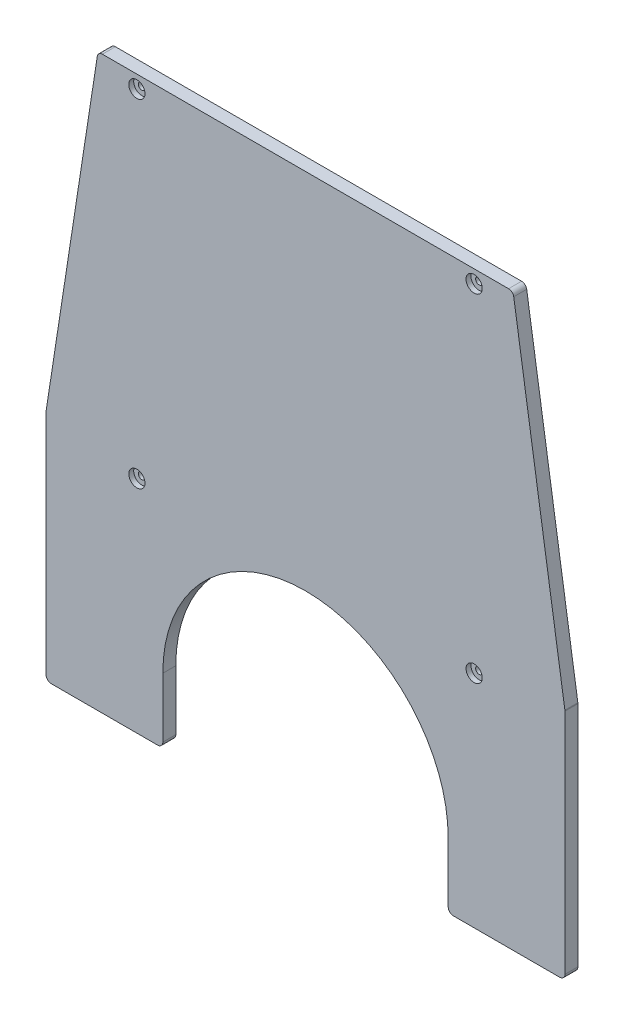
ISO-10303-21;
HEADER;
FILE_DESCRIPTION(('STEP AP214'),'2;1');
FILE_NAME('part.step','',(''),(''),'','','');
FILE_SCHEMA(('AUTOMOTIVE_DESIGN { 1 0 10303 214 1 1 1 1 }'));
ENDSEC;
DATA;
#1=APPLICATION_CONTEXT('core data for automotive mechanical design processes');
#2=APPLICATION_PROTOCOL_DEFINITION('international standard','automotive_design',2000,#1);
#3=PRODUCT_CONTEXT('',#1,'mechanical');
#4=PRODUCT('Part','Part','',(#3));
#5=PRODUCT_RELATED_PRODUCT_CATEGORY('part','',(#4));
#6=PRODUCT_DEFINITION_FORMATION('','',#4);
#7=PRODUCT_DEFINITION_CONTEXT('part definition',#1,'design');
#8=PRODUCT_DEFINITION('design','',#6,#7);
#9=PRODUCT_DEFINITION_SHAPE('','',#8);
#10=(LENGTH_UNIT() NAMED_UNIT(*) SI_UNIT(.MILLI.,.METRE.));
#11=(NAMED_UNIT(*) PLANE_ANGLE_UNIT() SI_UNIT($,.RADIAN.));
#12=(NAMED_UNIT(*) SI_UNIT($,.STERADIAN.) SOLID_ANGLE_UNIT());
#13=UNCERTAINTY_MEASURE_WITH_UNIT(LENGTH_MEASURE(1.E-05),#10,'distance_accuracy_value','');
#14=(GEOMETRIC_REPRESENTATION_CONTEXT(3) GLOBAL_UNCERTAINTY_ASSIGNED_CONTEXT((#13)) GLOBAL_UNIT_ASSIGNED_CONTEXT((#10,
#11,#12)) REPRESENTATION_CONTEXT('',''));
#15=CARTESIAN_POINT('',(0.,0.,0.));
#16=DIRECTION('',(0.,0.,1.));
#17=DIRECTION('',(1.,0.,0.));
#18=AXIS2_PLACEMENT_3D('',#15,#16,#17);
#19=CARTESIAN_POINT('',(0.,0.,12.7));
#20=DIRECTION('',(0.,0.,-1.));
#21=DIRECTION('',(-1.,0.,0.));
#22=AXIS2_PLACEMENT_3D('',#19,#20,#21);
#23=CYLINDRICAL_SURFACE('',#22,139.7);
#24=CARTESIAN_POINT('',(0.,0.,0.));
#25=DIRECTION('',(0.,0.,1.));
#26=DIRECTION('',(1.,0.,0.));
#27=AXIS2_PLACEMENT_3D('',#24,#25,#26);
#28=CIRCLE('',#27,139.7);
#29=CARTESIAN_POINT('',(139.7,0.,0.));
#30=VERTEX_POINT('',#29);
#31=CARTESIAN_POINT('',(-139.7,0.,0.));
#32=VERTEX_POINT('',#31);
#33=EDGE_CURVE('E179',#30,#32,#28,.T.);
#34=ORIENTED_EDGE('',*,*,#33,.F.);
#35=DIRECTION('',(0.,0.,-1.));
#36=VECTOR('',#35,1.);
#37=CARTESIAN_POINT('',(139.7,0.,12.7));
#38=LINE('',#37,#36);
#39=CARTESIAN_POINT('',(139.7,0.,12.7));
#40=VERTEX_POINT('',#39);
#41=EDGE_CURVE('E174',#40,#30,#38,.T.);
#42=ORIENTED_EDGE('',*,*,#41,.F.);
#43=CARTESIAN_POINT('',(0.,0.,12.7));
#44=DIRECTION('',(0.,0.,1.));
#45=DIRECTION('',(1.,0.,0.));
#46=AXIS2_PLACEMENT_3D('',#43,#44,#45);
#47=CIRCLE('',#46,139.7);
#48=CARTESIAN_POINT('',(-139.7,0.,12.7));
#49=VERTEX_POINT('',#48);
#50=EDGE_CURVE('E177',#40,#49,#47,.T.);
#51=ORIENTED_EDGE('',*,*,#50,.T.);
#52=DIRECTION('',(0.,0.,-1.));
#53=VECTOR('',#52,1.);
#54=CARTESIAN_POINT('',(-139.7,0.,12.7));
#55=LINE('',#54,#53);
#56=EDGE_CURVE('E185',#49,#32,#55,.T.);
#57=ORIENTED_EDGE('',*,*,#56,.T.);
#58=EDGE_LOOP('',(#34,#42,#51,#57));
#59=FACE_BOUND('',#58,.T.);
#60=ADVANCED_FACE('F47',(#59),#23,.F.);
#61=CARTESIAN_POINT('',(139.7,0.,12.7));
#62=DIRECTION('',(1.,0.,0.));
#63=DIRECTION('',(0.,0.,-1.));
#64=AXIS2_PLACEMENT_3D('',#61,#62,#63);
#65=PLANE('',#64);
#66=DIRECTION('',(0.,-1.,0.));
#67=VECTOR('',#66,1.);
#68=CARTESIAN_POINT('',(139.7,0.,0.));
#69=LINE('',#68,#67);
#70=CARTESIAN_POINT('',(139.7,-58.42,0.));
#71=VERTEX_POINT('',#70);
#72=EDGE_CURVE('E240',#30,#71,#69,.T.);
#73=ORIENTED_EDGE('',*,*,#72,.T.);
#74=DIRECTION('',(0.,0.,-1.));
#75=VECTOR('',#74,1.);
#76=CARTESIAN_POINT('',(139.7,-58.42,12.7));
#77=LINE('',#76,#75);
#78=CARTESIAN_POINT('',(139.7,-58.42,12.7));
#79=VERTEX_POINT('',#78);
#80=EDGE_CURVE('E191',#71,#79,#77,.F.);
#81=ORIENTED_EDGE('',*,*,#80,.T.);
#82=DIRECTION('',(0.,-1.,0.));
#83=VECTOR('',#82,1.);
#84=CARTESIAN_POINT('',(139.7,0.,12.7));
#85=LINE('',#84,#83);
#86=EDGE_CURVE('E188',#40,#79,#85,.T.);
#87=ORIENTED_EDGE('',*,*,#86,.F.);
#88=ORIENTED_EDGE('',*,*,#41,.T.);
#89=EDGE_LOOP('',(#73,#81,#87,#88));
#90=FACE_BOUND('',#89,.T.);
#91=ADVANCED_FACE('F189',(#90),#65,.F.);
#92=CARTESIAN_POINT('',(0.,-63.5,12.7));
#93=DIRECTION('',(0.,1.,0.));
#94=DIRECTION('',(0.,0.,1.));
#95=AXIS2_PLACEMENT_3D('',#92,#93,#94);
#96=PLANE('',#95);
#97=DIRECTION('',(1.,0.,0.));
#98=VECTOR('',#97,1.);
#99=CARTESIAN_POINT('',(0.,-63.5,0.));
#100=LINE('',#99,#98);
#101=CARTESIAN_POINT('',(144.78,-63.5,0.));
#102=VERTEX_POINT('',#101);
#103=CARTESIAN_POINT('',(248.92,-63.5,0.));
#104=VERTEX_POINT('',#103);
#105=EDGE_CURVE('E243',#102,#104,#100,.T.);
#106=ORIENTED_EDGE('',*,*,#105,.T.);
#107=DIRECTION('',(0.,0.,-1.));
#108=VECTOR('',#107,1.);
#109=CARTESIAN_POINT('',(248.92,-63.5,12.7));
#110=LINE('',#109,#108);
#111=CARTESIAN_POINT('',(248.92,-63.5,12.7));
#112=VERTEX_POINT('',#111);
#113=EDGE_CURVE('E356',#104,#112,#110,.F.);
#114=ORIENTED_EDGE('',*,*,#113,.T.);
#115=DIRECTION('',(1.,0.,0.));
#116=VECTOR('',#115,1.);
#117=CARTESIAN_POINT('',(0.,-63.5,12.7));
#118=LINE('',#117,#116);
#119=CARTESIAN_POINT('',(144.78,-63.5,12.7));
#120=VERTEX_POINT('',#119);
#121=EDGE_CURVE('E194',#120,#112,#118,.T.);
#122=ORIENTED_EDGE('',*,*,#121,.F.);
#123=DIRECTION('',(0.,0.,-1.));
#124=VECTOR('',#123,1.);
#125=CARTESIAN_POINT('',(144.78,-63.5,12.7));
#126=LINE('',#125,#124);
#127=EDGE_CURVE('E352',#120,#102,#126,.T.);
#128=ORIENTED_EDGE('',*,*,#127,.T.);
#129=EDGE_LOOP('',(#106,#114,#122,#128));
#130=FACE_BOUND('',#129,.T.);
#131=ADVANCED_FACE('F388',(#130),#96,.F.);
#132=CARTESIAN_POINT('',(254.,0.,12.7));
#133=DIRECTION('',(-1.,0.,0.));
#134=DIRECTION('',(0.,0.,1.));
#135=AXIS2_PLACEMENT_3D('',#132,#133,#134);
#136=PLANE('',#135);
#137=DIRECTION('',(0.,1.,0.));
#138=VECTOR('',#137,1.);
#139=CARTESIAN_POINT('',(254.,0.,0.));
#140=LINE('',#139,#138);
#141=CARTESIAN_POINT('',(254.,-58.42,0.));
#142=VERTEX_POINT('',#141);
#143=CARTESIAN_POINT('',(254.,164.711516047567,0.));
#144=VERTEX_POINT('',#143);
#145=EDGE_CURVE('E247',#142,#144,#140,.T.);
#146=ORIENTED_EDGE('',*,*,#145,.T.);
#147=DIRECTION('',(0.,0.,-1.));
#148=VECTOR('',#147,1.);
#149=CARTESIAN_POINT('',(254.,164.711516047567,12.7));
#150=LINE('',#149,#148);
#151=CARTESIAN_POINT('',(254.,164.711516047567,12.7));
#152=VERTEX_POINT('',#151);
#153=EDGE_CURVE('E349',#144,#152,#150,.F.);
#154=ORIENTED_EDGE('',*,*,#153,.T.);
#155=DIRECTION('',(0.,1.,0.));
#156=VECTOR('',#155,1.);
#157=CARTESIAN_POINT('',(254.,0.,12.7));
#158=LINE('',#157,#156);
#159=CARTESIAN_POINT('',(254.,-58.42,12.7));
#160=VERTEX_POINT('',#159);
#161=EDGE_CURVE('E213',#160,#152,#158,.T.);
#162=ORIENTED_EDGE('',*,*,#161,.F.);
#163=DIRECTION('',(0.,0.,-1.));
#164=VECTOR('',#163,1.);
#165=CARTESIAN_POINT('',(254.,-58.42,12.7));
#166=LINE('',#165,#164);
#167=EDGE_CURVE('E345',#160,#142,#166,.T.);
#168=ORIENTED_EDGE('',*,*,#167,.T.);
#169=EDGE_LOOP('',(#146,#154,#162,#168));
#170=FACE_BOUND('',#169,.T.);
#171=ADVANCED_FACE('F396',(#170),#136,.F.);
#172=CARTESIAN_POINT('',(272.939884393064,41.9907514450867,12.7));
#173=DIRECTION('',(-0.988371697650617,-0.152057184253941,0.));
#174=DIRECTION('',(0.152057184253941,-0.988371697650617,0.));
#175=AXIS2_PLACEMENT_3D('',#172,#173,#174);
#176=PLANE('',#175);
#177=DIRECTION('',(-0.152057184253941,0.988371697650617,0.));
#178=VECTOR('',#177,1.);
#179=CARTESIAN_POINT('',(272.939884393064,41.9907514450867,0.));
#180=LINE('',#179,#178);
#181=CARTESIAN_POINT('',(253.940928224065,165.483966543577,0.));
#182=VERTEX_POINT('',#181);
#183=CARTESIAN_POINT('',(203.862699923691,490.99245049601,0.));
#184=VERTEX_POINT('',#183);
#185=EDGE_CURVE('E251',#182,#184,#180,.T.);
#186=ORIENTED_EDGE('',*,*,#185,.T.);
#187=DIRECTION('',(0.,0.,-1.));
#188=VECTOR('',#187,1.);
#189=CARTESIAN_POINT('',(203.862699923691,490.99245049601,12.7));
#190=LINE('',#189,#188);
#191=CARTESIAN_POINT('',(203.862699923691,490.99245049601,12.7));
#192=VERTEX_POINT('',#191);
#193=EDGE_CURVE('E342',#184,#192,#190,.F.);
#194=ORIENTED_EDGE('',*,*,#193,.T.);
#195=DIRECTION('',(-0.152057184253941,0.988371697650617,0.));
#196=VECTOR('',#195,1.);
#197=CARTESIAN_POINT('',(272.939884393064,41.9907514450867,12.7));
#198=LINE('',#197,#196);
#199=CARTESIAN_POINT('',(253.940928224065,165.483966543577,12.7));
#200=VERTEX_POINT('',#199);
#201=EDGE_CURVE('E217',#200,#192,#198,.T.);
#202=ORIENTED_EDGE('',*,*,#201,.F.);
#203=DIRECTION('',(0.,0.,-1.));
#204=VECTOR('',#203,1.);
#205=CARTESIAN_POINT('',(253.940928224065,165.483966543577,12.7));
#206=LINE('',#205,#204);
#207=EDGE_CURVE('E338',#200,#182,#206,.T.);
#208=ORIENTED_EDGE('',*,*,#207,.T.);
#209=EDGE_LOOP('',(#186,#194,#202,#208));
#210=FACE_BOUND('',#209,.T.);
#211=ADVANCED_FACE('F405',(#210),#176,.F.);
#212=CARTESIAN_POINT('',(0.,495.3,12.7));
#213=DIRECTION('',(0.,-1.,0.));
#214=DIRECTION('',(1.,0.,0.));
#215=AXIS2_PLACEMENT_3D('',#212,#213,#214);
#216=PLANE('',#215);
#217=DIRECTION('',(-1.,0.,0.));
#218=VECTOR('',#217,1.);
#219=CARTESIAN_POINT('',(0.,495.3,0.));
#220=LINE('',#219,#218);
#221=CARTESIAN_POINT('',(198.841771699626,495.3,0.));
#222=VERTEX_POINT('',#221);
#223=CARTESIAN_POINT('',(-198.841771699626,495.3,0.));
#224=VERTEX_POINT('',#223);
#225=EDGE_CURVE('E255',#222,#224,#220,.T.);
#226=ORIENTED_EDGE('',*,*,#225,.T.);
#227=DIRECTION('',(0.,0.,-1.));
#228=VECTOR('',#227,1.);
#229=CARTESIAN_POINT('',(-198.841771699626,495.3,12.7));
#230=LINE('',#229,#228);
#231=CARTESIAN_POINT('',(-198.841771699626,495.3,12.7));
#232=VERTEX_POINT('',#231);
#233=EDGE_CURVE('E335',#224,#232,#230,.F.);
#234=ORIENTED_EDGE('',*,*,#233,.T.);
#235=DIRECTION('',(-1.,0.,0.));
#236=VECTOR('',#235,1.);
#237=CARTESIAN_POINT('',(0.,495.3,12.7));
#238=LINE('',#237,#236);
#239=CARTESIAN_POINT('',(198.841771699626,495.3,12.7));
#240=VERTEX_POINT('',#239);
#241=EDGE_CURVE('E221',#240,#232,#238,.T.);
#242=ORIENTED_EDGE('',*,*,#241,.F.);
#243=DIRECTION('',(0.,0.,-1.));
#244=VECTOR('',#243,1.);
#245=CARTESIAN_POINT('',(198.841771699626,495.3,12.7));
#246=LINE('',#245,#244);
#247=EDGE_CURVE('E331',#240,#222,#246,.T.);
#248=ORIENTED_EDGE('',*,*,#247,.T.);
#249=EDGE_LOOP('',(#226,#234,#242,#248));
#250=FACE_BOUND('',#249,.T.);
#251=ADVANCED_FACE('F414',(#250),#216,.F.);
#252=CARTESIAN_POINT('',(-272.939884393064,41.9907514450867,12.7));
#253=DIRECTION('',(-0.988371697650617,0.152057184253941,0.));
#254=DIRECTION('',(-0.152057184253941,-0.988371697650617,0.));
#255=AXIS2_PLACEMENT_3D('',#252,#253,#254);
#256=PLANE('',#255);
#257=DIRECTION('',(0.152057184253941,0.988371697650617,0.));
#258=VECTOR('',#257,1.);
#259=CARTESIAN_POINT('',(-272.939884393064,41.9907514450867,0.));
#260=LINE('',#259,#258);
#261=CARTESIAN_POINT('',(-253.940928224065,165.483966543577,0.));
#262=VERTEX_POINT('',#261);
#263=CARTESIAN_POINT('',(-203.862699923691,490.99245049601,0.));
#264=VERTEX_POINT('',#263);
#265=EDGE_CURVE('E259',#262,#264,#260,.T.);
#266=ORIENTED_EDGE('',*,*,#265,.F.);
#267=DIRECTION('',(0.,0.,-1.));
#268=VECTOR('',#267,1.);
#269=CARTESIAN_POINT('',(-253.940928224065,165.483966543577,12.7));
#270=LINE('',#269,#268);
#271=CARTESIAN_POINT('',(-253.940928224065,165.483966543577,12.7));
#272=VERTEX_POINT('',#271);
#273=EDGE_CURVE('E306',#262,#272,#270,.F.);
#274=ORIENTED_EDGE('',*,*,#273,.T.);
#275=DIRECTION('',(0.152057184253941,0.988371697650617,0.));
#276=VECTOR('',#275,1.);
#277=CARTESIAN_POINT('',(-272.939884393064,41.9907514450867,12.7));
#278=LINE('',#277,#276);
#279=CARTESIAN_POINT('',(-203.862699923691,490.99245049601,12.7));
#280=VERTEX_POINT('',#279);
#281=EDGE_CURVE('E225',#272,#280,#278,.T.);
#282=ORIENTED_EDGE('',*,*,#281,.T.);
#283=DIRECTION('',(0.,0.,-1.));
#284=VECTOR('',#283,1.);
#285=CARTESIAN_POINT('',(-203.862699923691,490.99245049601,0.));
#286=LINE('',#285,#284);
#287=EDGE_CURVE('E302',#280,#264,#286,.T.);
#288=ORIENTED_EDGE('',*,*,#287,.T.);
#289=EDGE_LOOP('',(#266,#274,#282,#288));
#290=FACE_BOUND('',#289,.T.);
#291=ADVANCED_FACE('F423',(#290),#256,.T.);
#292=CARTESIAN_POINT('',(-254.,0.,12.7));
#293=DIRECTION('',(-1.,0.,0.));
#294=DIRECTION('',(0.,0.,1.));
#295=AXIS2_PLACEMENT_3D('',#292,#293,#294);
#296=PLANE('',#295);
#297=DIRECTION('',(0.,1.,0.));
#298=VECTOR('',#297,1.);
#299=CARTESIAN_POINT('',(-254.,0.,12.7));
#300=LINE('',#299,#298);
#301=CARTESIAN_POINT('',(-254.,-58.42,12.7));
#302=VERTEX_POINT('',#301);
#303=CARTESIAN_POINT('',(-254.,164.711516047567,12.7));
#304=VERTEX_POINT('',#303);
#305=EDGE_CURVE('E229',#302,#304,#300,.T.);
#306=ORIENTED_EDGE('',*,*,#305,.T.);
#307=DIRECTION('',(0.,0.,-1.));
#308=VECTOR('',#307,1.);
#309=CARTESIAN_POINT('',(-254.,164.711516047567,12.7));
#310=LINE('',#309,#308);
#311=CARTESIAN_POINT('',(-254.,164.711516047567,0.));
#312=VERTEX_POINT('',#311);
#313=EDGE_CURVE('E274',#304,#312,#310,.T.);
#314=ORIENTED_EDGE('',*,*,#313,.T.);
#315=DIRECTION('',(0.,1.,0.));
#316=VECTOR('',#315,1.);
#317=CARTESIAN_POINT('',(-254.,0.,0.));
#318=LINE('',#317,#316);
#319=CARTESIAN_POINT('',(-254.,-58.42,0.));
#320=VERTEX_POINT('',#319);
#321=EDGE_CURVE('E263',#320,#312,#318,.T.);
#322=ORIENTED_EDGE('',*,*,#321,.F.);
#323=DIRECTION('',(0.,0.,-1.));
#324=VECTOR('',#323,1.);
#325=CARTESIAN_POINT('',(-254.,-58.42,12.7));
#326=LINE('',#325,#324);
#327=EDGE_CURVE('E184',#320,#302,#326,.F.);
#328=ORIENTED_EDGE('',*,*,#327,.T.);
#329=EDGE_LOOP('',(#306,#314,#322,#328));
#330=FACE_BOUND('',#329,.T.);
#331=ADVANCED_FACE('F429',(#330),#296,.T.);
#332=CARTESIAN_POINT('',(0.,-63.5,12.7));
#333=DIRECTION('',(0.,-1.,0.));
#334=DIRECTION('',(0.,0.,-1.));
#335=AXIS2_PLACEMENT_3D('',#332,#333,#334);
#336=PLANE('',#335);
#337=DIRECTION('',(-1.,0.,0.));
#338=VECTOR('',#337,1.);
#339=CARTESIAN_POINT('',(0.,-63.5,0.));
#340=LINE('',#339,#338);
#341=CARTESIAN_POINT('',(-144.78,-63.5,0.));
#342=VERTEX_POINT('',#341);
#343=CARTESIAN_POINT('',(-248.92,-63.5,0.));
#344=VERTEX_POINT('',#343);
#345=EDGE_CURVE('E204',#342,#344,#340,.T.);
#346=ORIENTED_EDGE('',*,*,#345,.F.);
#347=DIRECTION('',(0.,0.,-1.));
#348=VECTOR('',#347,1.);
#349=CARTESIAN_POINT('',(-144.78,-63.5,12.7));
#350=LINE('',#349,#348);
#351=CARTESIAN_POINT('',(-144.78,-63.5,12.7));
#352=VERTEX_POINT('',#351);
#353=EDGE_CURVE('E11',#342,#352,#350,.F.);
#354=ORIENTED_EDGE('',*,*,#353,.T.);
#355=DIRECTION('',(-1.,0.,0.));
#356=VECTOR('',#355,1.);
#357=CARTESIAN_POINT('',(0.,-63.5,12.7));
#358=LINE('',#357,#356);
#359=CARTESIAN_POINT('',(-248.92,-63.5,12.7));
#360=VERTEX_POINT('',#359);
#361=EDGE_CURVE('E233',#352,#360,#358,.T.);
#362=ORIENTED_EDGE('',*,*,#361,.T.);
#363=DIRECTION('',(0.,0.,-1.));
#364=VECTOR('',#363,1.);
#365=CARTESIAN_POINT('',(-248.92,-63.5,12.7));
#366=LINE('',#365,#364);
#367=EDGE_CURVE('E56',#360,#344,#366,.T.);
#368=ORIENTED_EDGE('',*,*,#367,.T.);
#369=EDGE_LOOP('',(#346,#354,#362,#368));
#370=FACE_BOUND('',#369,.T.);
#371=ADVANCED_FACE('F369',(#370),#336,.T.);
#372=CARTESIAN_POINT('',(-139.7,0.,12.7));
#373=DIRECTION('',(1.,0.,0.));
#374=DIRECTION('',(0.,0.,-1.));
#375=AXIS2_PLACEMENT_3D('',#372,#373,#374);
#376=PLANE('',#375);
#377=DIRECTION('',(0.,-1.,0.));
#378=VECTOR('',#377,1.);
#379=CARTESIAN_POINT('',(-139.7,0.,12.7));
#380=LINE('',#379,#378);
#381=CARTESIAN_POINT('',(-139.7,-58.42,12.7));
#382=VERTEX_POINT('',#381);
#383=EDGE_CURVE('E198',#49,#382,#380,.T.);
#384=ORIENTED_EDGE('',*,*,#383,.T.);
#385=DIRECTION('',(0.,0.,-1.));
#386=VECTOR('',#385,1.);
#387=CARTESIAN_POINT('',(-139.7,-58.42,12.7));
#388=LINE('',#387,#386);
#389=CARTESIAN_POINT('',(-139.7,-58.42,0.));
#390=VERTEX_POINT('',#389);
#391=EDGE_CURVE('E361',#382,#390,#388,.T.);
#392=ORIENTED_EDGE('',*,*,#391,.T.);
#393=DIRECTION('',(0.,-1.,0.));
#394=VECTOR('',#393,1.);
#395=CARTESIAN_POINT('',(-139.7,0.,0.));
#396=LINE('',#395,#394);
#397=EDGE_CURVE('E200',#32,#390,#396,.T.);
#398=ORIENTED_EDGE('',*,*,#397,.F.);
#399=ORIENTED_EDGE('',*,*,#56,.F.);
#400=EDGE_LOOP('',(#384,#392,#398,#399));
#401=FACE_BOUND('',#400,.T.);
#402=ADVANCED_FACE('F380',(#401),#376,.T.);
#403=CARTESIAN_POINT('',(0.,0.,12.7));
#404=DIRECTION('',(0.,0.,1.));
#405=DIRECTION('',(1.,0.,0.));
#406=AXIS2_PLACEMENT_3D('',#403,#404,#405);
#407=PLANE('',#406);
#408=CARTESIAN_POINT('',(165.1,482.6,12.7));
#409=DIRECTION('',(0.,0.,1.));
#410=DIRECTION('',(1.,0.,0.));
#411=AXIS2_PLACEMENT_3D('',#408,#409,#410);
#412=CIRCLE('',#411,7.93749999999999);
#413=CARTESIAN_POINT('',(173.0375,482.6,12.7));
#414=VERTEX_POINT('',#413);
#415=EDGE_CURVE('E804',#414,#414,#412,.T.);
#416=ORIENTED_EDGE('',*,*,#415,.F.);
#417=EDGE_LOOP('',(#416));
#418=FACE_BOUND('',#417,.T.);
#419=CARTESIAN_POINT('',(165.1,152.4,12.7));
#420=DIRECTION('',(0.,0.,1.));
#421=DIRECTION('',(1.,0.,0.));
#422=AXIS2_PLACEMENT_3D('',#419,#420,#421);
#423=CIRCLE('',#422,7.93749999999999);
#424=CARTESIAN_POINT('',(173.0375,152.4,12.7));
#425=VERTEX_POINT('',#424);
#426=EDGE_CURVE('E790',#425,#425,#423,.T.);
#427=ORIENTED_EDGE('',*,*,#426,.F.);
#428=EDGE_LOOP('',(#427));
#429=FACE_BOUND('',#428,.T.);
#430=CARTESIAN_POINT('',(-165.1,152.4,12.7));
#431=DIRECTION('',(0.,0.,1.));
#432=DIRECTION('',(1.,0.,0.));
#433=AXIS2_PLACEMENT_3D('',#430,#431,#432);
#434=CIRCLE('',#433,7.93749999999999);
#435=CARTESIAN_POINT('',(-157.1625,152.4,12.7));
#436=VERTEX_POINT('',#435);
#437=EDGE_CURVE('E776',#436,#436,#434,.T.);
#438=ORIENTED_EDGE('',*,*,#437,.F.);
#439=EDGE_LOOP('',(#438));
#440=FACE_BOUND('',#439,.T.);
#441=CARTESIAN_POINT('',(-165.1,482.6,12.7));
#442=DIRECTION('',(0.,0.,1.));
#443=DIRECTION('',(1.,0.,0.));
#444=AXIS2_PLACEMENT_3D('',#441,#442,#443);
#445=CIRCLE('',#444,7.93749999999999);
#446=CARTESIAN_POINT('',(-157.1625,482.6,12.7));
#447=VERTEX_POINT('',#446);
#448=EDGE_CURVE('E760',#447,#447,#445,.T.);
#449=ORIENTED_EDGE('',*,*,#448,.F.);
#450=EDGE_LOOP('',(#449));
#451=FACE_BOUND('',#450,.T.);
#452=ORIENTED_EDGE('',*,*,#281,.F.);
#453=CARTESIAN_POINT('',(-248.92,164.711516047567,12.7));
#454=DIRECTION('',(0.,0.,1.));
#455=DIRECTION('',(1.,0.,0.));
#456=AXIS2_PLACEMENT_3D('',#453,#454,#455);
#457=CIRCLE('',#456,5.08);
#458=EDGE_CURVE('E328',#272,#304,#457,.T.);
#459=ORIENTED_EDGE('',*,*,#458,.T.);
#460=ORIENTED_EDGE('',*,*,#305,.F.);
#461=CARTESIAN_POINT('',(-248.92,-58.42,12.7));
#462=DIRECTION('',(0.,0.,1.));
#463=DIRECTION('',(1.,0.,0.));
#464=AXIS2_PLACEMENT_3D('',#461,#462,#463);
#465=CIRCLE('',#464,5.08);
#466=EDGE_CURVE('E69',#302,#360,#465,.T.);
#467=ORIENTED_EDGE('',*,*,#466,.T.);
#468=ORIENTED_EDGE('',*,*,#361,.F.);
#469=CARTESIAN_POINT('',(-144.78,-58.42,12.7));
#470=DIRECTION('',(0.,0.,1.));
#471=DIRECTION('',(1.,0.,0.));
#472=AXIS2_PLACEMENT_3D('',#469,#470,#471);
#473=CIRCLE('',#472,5.08);
#474=EDGE_CURVE('E63',#352,#382,#473,.T.);
#475=ORIENTED_EDGE('',*,*,#474,.T.);
#476=ORIENTED_EDGE('',*,*,#383,.F.);
#477=ORIENTED_EDGE('',*,*,#50,.F.);
#478=ORIENTED_EDGE('',*,*,#86,.T.);
#479=CARTESIAN_POINT('',(144.78,-58.42,12.7));
#480=DIRECTION('',(0.,0.,1.));
#481=DIRECTION('',(1.,0.,0.));
#482=AXIS2_PLACEMENT_3D('',#479,#480,#481);
#483=CIRCLE('',#482,5.08);
#484=EDGE_CURVE('E313',#79,#120,#483,.T.);
#485=ORIENTED_EDGE('',*,*,#484,.T.);
#486=ORIENTED_EDGE('',*,*,#121,.T.);
#487=CARTESIAN_POINT('',(248.92,-58.42,12.7));
#488=DIRECTION('',(0.,0.,1.));
#489=DIRECTION('',(1.,0.,0.));
#490=AXIS2_PLACEMENT_3D('',#487,#488,#489);
#491=CIRCLE('',#490,5.08);
#492=EDGE_CURVE('E316',#112,#160,#491,.T.);
#493=ORIENTED_EDGE('',*,*,#492,.T.);
#494=ORIENTED_EDGE('',*,*,#161,.T.);
#495=CARTESIAN_POINT('',(248.92,164.711516047567,12.7));
#496=DIRECTION('',(0.,0.,1.));
#497=DIRECTION('',(1.,0.,0.));
#498=AXIS2_PLACEMENT_3D('',#495,#496,#497);
#499=CIRCLE('',#498,5.08);
#500=EDGE_CURVE('E319',#152,#200,#499,.T.);
#501=ORIENTED_EDGE('',*,*,#500,.T.);
#502=ORIENTED_EDGE('',*,*,#201,.T.);
#503=CARTESIAN_POINT('',(198.841771699626,490.22,12.7));
#504=DIRECTION('',(0.,0.,1.));
#505=DIRECTION('',(1.,0.,0.));
#506=AXIS2_PLACEMENT_3D('',#503,#504,#505);
#507=CIRCLE('',#506,5.08);
#508=EDGE_CURVE('E322',#192,#240,#507,.T.);
#509=ORIENTED_EDGE('',*,*,#508,.T.);
#510=ORIENTED_EDGE('',*,*,#241,.T.);
#511=CARTESIAN_POINT('',(-198.841771699626,490.22,12.7));
#512=DIRECTION('',(0.,0.,1.));
#513=DIRECTION('',(1.,0.,0.));
#514=AXIS2_PLACEMENT_3D('',#511,#512,#513);
#515=CIRCLE('',#514,5.08);
#516=EDGE_CURVE('E325',#232,#280,#515,.T.);
#517=ORIENTED_EDGE('',*,*,#516,.T.);
#518=EDGE_LOOP('',(#452,#459,#460,#467,#468,#475,#476,#477,#478,#485,#486,#493,#494,#501,#502,
#509,#510,#517));
#519=FACE_BOUND('',#518,.T.);
#520=ADVANCED_FACE('F197',(#418,#429,#440,#451,#519),#407,.T.);
#521=CARTESIAN_POINT('',(0.,0.,0.));
#522=DIRECTION('',(0.,0.,1.));
#523=DIRECTION('',(1.,0.,0.));
#524=AXIS2_PLACEMENT_3D('',#521,#522,#523);
#525=PLANE('',#524);
#526=CARTESIAN_POINT('',(165.1,482.6,0.));
#527=DIRECTION('',(0.,0.,1.));
#528=DIRECTION('',(1.,0.,0.));
#529=AXIS2_PLACEMENT_3D('',#526,#527,#528);
#530=CIRCLE('',#529,3.3782);
#531=CARTESIAN_POINT('',(168.4782,482.6,0.));
#532=VERTEX_POINT('',#531);
#533=EDGE_CURVE('E740',#532,#532,#530,.T.);
#534=ORIENTED_EDGE('',*,*,#533,.T.);
#535=EDGE_LOOP('',(#534));
#536=FACE_BOUND('',#535,.T.);
#537=CARTESIAN_POINT('',(165.1,152.4,0.));
#538=DIRECTION('',(0.,0.,1.));
#539=DIRECTION('',(1.,0.,0.));
#540=AXIS2_PLACEMENT_3D('',#537,#538,#539);
#541=CIRCLE('',#540,3.3782);
#542=CARTESIAN_POINT('',(168.4782,152.4,0.));
#543=VERTEX_POINT('',#542);
#544=EDGE_CURVE('E744',#543,#543,#541,.T.);
#545=ORIENTED_EDGE('',*,*,#544,.T.);
#546=EDGE_LOOP('',(#545));
#547=FACE_BOUND('',#546,.T.);
#548=CARTESIAN_POINT('',(-165.1,152.4,0.));
#549=DIRECTION('',(0.,0.,1.));
#550=DIRECTION('',(1.,0.,0.));
#551=AXIS2_PLACEMENT_3D('',#548,#549,#550);
#552=CIRCLE('',#551,3.3782);
#553=CARTESIAN_POINT('',(-161.7218,152.4,0.));
#554=VERTEX_POINT('',#553);
#555=EDGE_CURVE('E748',#554,#554,#552,.T.);
#556=ORIENTED_EDGE('',*,*,#555,.T.);
#557=EDGE_LOOP('',(#556));
#558=FACE_BOUND('',#557,.T.);
#559=CARTESIAN_POINT('',(-165.1,482.6,0.));
#560=DIRECTION('',(0.,0.,1.));
#561=DIRECTION('',(1.,0.,0.));
#562=AXIS2_PLACEMENT_3D('',#559,#560,#561);
#563=CIRCLE('',#562,3.3782);
#564=CARTESIAN_POINT('',(-161.7218,482.6,0.));
#565=VERTEX_POINT('',#564);
#566=EDGE_CURVE('E207',#565,#565,#563,.T.);
#567=ORIENTED_EDGE('',*,*,#566,.T.);
#568=EDGE_LOOP('',(#567));
#569=FACE_BOUND('',#568,.T.);
#570=ORIENTED_EDGE('',*,*,#321,.T.);
#571=CARTESIAN_POINT('',(-248.92,164.711516047567,0.));
#572=DIRECTION('',(0.,0.,1.));
#573=DIRECTION('',(1.,0.,0.));
#574=AXIS2_PLACEMENT_3D('',#571,#572,#573);
#575=CIRCLE('',#574,5.08);
#576=EDGE_CURVE('E299',#312,#262,#575,.F.);
#577=ORIENTED_EDGE('',*,*,#576,.T.);
#578=ORIENTED_EDGE('',*,*,#265,.T.);
#579=CARTESIAN_POINT('',(-198.841771699626,490.22,0.));
#580=DIRECTION('',(0.,0.,1.));
#581=DIRECTION('',(1.,0.,0.));
#582=AXIS2_PLACEMENT_3D('',#579,#580,#581);
#583=CIRCLE('',#582,5.08);
#584=EDGE_CURVE('E296',#264,#224,#583,.F.);
#585=ORIENTED_EDGE('',*,*,#584,.T.);
#586=ORIENTED_EDGE('',*,*,#225,.F.);
#587=CARTESIAN_POINT('',(198.841771699626,490.22,0.));
#588=DIRECTION('',(0.,0.,1.));
#589=DIRECTION('',(1.,0.,0.));
#590=AXIS2_PLACEMENT_3D('',#587,#588,#589);
#591=CIRCLE('',#590,5.08);
#592=EDGE_CURVE('E293',#222,#184,#591,.F.);
#593=ORIENTED_EDGE('',*,*,#592,.T.);
#594=ORIENTED_EDGE('',*,*,#185,.F.);
#595=CARTESIAN_POINT('',(248.92,164.711516047567,0.));
#596=DIRECTION('',(0.,0.,1.));
#597=DIRECTION('',(1.,0.,0.));
#598=AXIS2_PLACEMENT_3D('',#595,#596,#597);
#599=CIRCLE('',#598,5.08);
#600=EDGE_CURVE('E290',#182,#144,#599,.F.);
#601=ORIENTED_EDGE('',*,*,#600,.T.);
#602=ORIENTED_EDGE('',*,*,#145,.F.);
#603=CARTESIAN_POINT('',(248.92,-58.42,0.));
#604=DIRECTION('',(0.,0.,1.));
#605=DIRECTION('',(1.,0.,0.));
#606=AXIS2_PLACEMENT_3D('',#603,#604,#605);
#607=CIRCLE('',#606,5.08);
#608=EDGE_CURVE('E287',#142,#104,#607,.F.);
#609=ORIENTED_EDGE('',*,*,#608,.T.);
#610=ORIENTED_EDGE('',*,*,#105,.F.);
#611=CARTESIAN_POINT('',(144.78,-58.42,0.));
#612=DIRECTION('',(0.,0.,1.));
#613=DIRECTION('',(1.,0.,0.));
#614=AXIS2_PLACEMENT_3D('',#611,#612,#613);
#615=CIRCLE('',#614,5.08);
#616=EDGE_CURVE('E284',#102,#71,#615,.F.);
#617=ORIENTED_EDGE('',*,*,#616,.T.);
#618=ORIENTED_EDGE('',*,*,#72,.F.);
#619=ORIENTED_EDGE('',*,*,#33,.T.);
#620=ORIENTED_EDGE('',*,*,#397,.T.);
#621=CARTESIAN_POINT('',(-144.78,-58.42,0.));
#622=DIRECTION('',(0.,0.,1.));
#623=DIRECTION('',(1.,0.,0.));
#624=AXIS2_PLACEMENT_3D('',#621,#622,#623);
#625=CIRCLE('',#624,5.08);
#626=EDGE_CURVE('E281',#390,#342,#625,.F.);
#627=ORIENTED_EDGE('',*,*,#626,.T.);
#628=ORIENTED_EDGE('',*,*,#345,.T.);
#629=CARTESIAN_POINT('',(-248.92,-58.42,0.));
#630=DIRECTION('',(0.,0.,1.));
#631=DIRECTION('',(1.,0.,0.));
#632=AXIS2_PLACEMENT_3D('',#629,#630,#631);
#633=CIRCLE('',#632,5.08);
#634=EDGE_CURVE('E278',#344,#320,#633,.F.);
#635=ORIENTED_EDGE('',*,*,#634,.T.);
#636=EDGE_LOOP('',(#570,#577,#578,#585,#586,#593,#594,#601,#602,#609,#610,#617,#618,#619,#620,
#627,#628,#635));
#637=FACE_BOUND('',#636,.T.);
#638=ADVANCED_FACE('F373',(#536,#547,#558,#569,#637),#525,.F.);
#639=CARTESIAN_POINT('',(-248.92,164.711516047567,12.7));
#640=DIRECTION('',(0.,0.,-1.));
#641=DIRECTION('',(-1.,0.,0.));
#642=AXIS2_PLACEMENT_3D('',#639,#640,#641);
#643=CYLINDRICAL_SURFACE('',#642,5.08);
#644=ORIENTED_EDGE('',*,*,#458,.F.);
#645=ORIENTED_EDGE('',*,*,#273,.F.);
#646=ORIENTED_EDGE('',*,*,#576,.F.);
#647=ORIENTED_EDGE('',*,*,#313,.F.);
#648=EDGE_LOOP('',(#644,#645,#646,#647));
#649=FACE_BOUND('',#648,.T.);
#650=ADVANCED_FACE('F426',(#649),#643,.T.);
#651=CARTESIAN_POINT('',(-198.841771699626,490.22,12.7));
#652=DIRECTION('',(0.,0.,1.));
#653=DIRECTION('',(1.,0.,0.));
#654=AXIS2_PLACEMENT_3D('',#651,#652,#653);
#655=CYLINDRICAL_SURFACE('',#654,5.08);
#656=ORIENTED_EDGE('',*,*,#516,.F.);
#657=ORIENTED_EDGE('',*,*,#233,.F.);
#658=ORIENTED_EDGE('',*,*,#584,.F.);
#659=ORIENTED_EDGE('',*,*,#287,.F.);
#660=EDGE_LOOP('',(#656,#657,#658,#659));
#661=FACE_BOUND('',#660,.T.);
#662=ADVANCED_FACE('F418',(#661),#655,.T.);
#663=CARTESIAN_POINT('',(198.841771699626,490.22,12.7));
#664=DIRECTION('',(0.,0.,-1.));
#665=DIRECTION('',(-1.,0.,0.));
#666=AXIS2_PLACEMENT_3D('',#663,#664,#665);
#667=CYLINDRICAL_SURFACE('',#666,5.08);
#668=ORIENTED_EDGE('',*,*,#508,.F.);
#669=ORIENTED_EDGE('',*,*,#193,.F.);
#670=ORIENTED_EDGE('',*,*,#592,.F.);
#671=ORIENTED_EDGE('',*,*,#247,.F.);
#672=EDGE_LOOP('',(#668,#669,#670,#671));
#673=FACE_BOUND('',#672,.T.);
#674=ADVANCED_FACE('F409',(#673),#667,.T.);
#675=CARTESIAN_POINT('',(248.92,164.711516047567,12.7));
#676=DIRECTION('',(0.,0.,-1.));
#677=DIRECTION('',(-1.,0.,0.));
#678=AXIS2_PLACEMENT_3D('',#675,#676,#677);
#679=CYLINDRICAL_SURFACE('',#678,5.08);
#680=ORIENTED_EDGE('',*,*,#500,.F.);
#681=ORIENTED_EDGE('',*,*,#153,.F.);
#682=ORIENTED_EDGE('',*,*,#600,.F.);
#683=ORIENTED_EDGE('',*,*,#207,.F.);
#684=EDGE_LOOP('',(#680,#681,#682,#683));
#685=FACE_BOUND('',#684,.T.);
#686=ADVANCED_FACE('F400',(#685),#679,.T.);
#687=CARTESIAN_POINT('',(248.92,-58.42,12.7));
#688=DIRECTION('',(0.,0.,-1.));
#689=DIRECTION('',(-1.,0.,0.));
#690=AXIS2_PLACEMENT_3D('',#687,#688,#689);
#691=CYLINDRICAL_SURFACE('',#690,5.08);
#692=ORIENTED_EDGE('',*,*,#492,.F.);
#693=ORIENTED_EDGE('',*,*,#113,.F.);
#694=ORIENTED_EDGE('',*,*,#608,.F.);
#695=ORIENTED_EDGE('',*,*,#167,.F.);
#696=EDGE_LOOP('',(#692,#693,#694,#695));
#697=FACE_BOUND('',#696,.T.);
#698=ADVANCED_FACE('F391',(#697),#691,.T.);
#699=CARTESIAN_POINT('',(144.78,-58.42,12.7));
#700=DIRECTION('',(0.,0.,-1.));
#701=DIRECTION('',(-1.,0.,0.));
#702=AXIS2_PLACEMENT_3D('',#699,#700,#701);
#703=CYLINDRICAL_SURFACE('',#702,5.08);
#704=ORIENTED_EDGE('',*,*,#484,.F.);
#705=ORIENTED_EDGE('',*,*,#80,.F.);
#706=ORIENTED_EDGE('',*,*,#616,.F.);
#707=ORIENTED_EDGE('',*,*,#127,.F.);
#708=EDGE_LOOP('',(#704,#705,#706,#707));
#709=FACE_BOUND('',#708,.T.);
#710=ADVANCED_FACE('F383',(#709),#703,.T.);
#711=CARTESIAN_POINT('',(-144.78,-58.42,12.7));
#712=DIRECTION('',(0.,0.,-1.));
#713=DIRECTION('',(-1.,0.,0.));
#714=AXIS2_PLACEMENT_3D('',#711,#712,#713);
#715=CYLINDRICAL_SURFACE('',#714,5.08);
#716=ORIENTED_EDGE('',*,*,#474,.F.);
#717=ORIENTED_EDGE('',*,*,#353,.F.);
#718=ORIENTED_EDGE('',*,*,#626,.F.);
#719=ORIENTED_EDGE('',*,*,#391,.F.);
#720=EDGE_LOOP('',(#716,#717,#718,#719));
#721=FACE_BOUND('',#720,.T.);
#722=ADVANCED_FACE('F378',(#721),#715,.T.);
#723=CARTESIAN_POINT('',(-248.92,-58.42,12.7));
#724=DIRECTION('',(0.,0.,-1.));
#725=DIRECTION('',(-1.,0.,0.));
#726=AXIS2_PLACEMENT_3D('',#723,#724,#725);
#727=CYLINDRICAL_SURFACE('',#726,5.08);
#728=ORIENTED_EDGE('',*,*,#466,.F.);
#729=ORIENTED_EDGE('',*,*,#327,.F.);
#730=ORIENTED_EDGE('',*,*,#634,.F.);
#731=ORIENTED_EDGE('',*,*,#367,.F.);
#732=EDGE_LOOP('',(#728,#729,#730,#731));
#733=FACE_BOUND('',#732,.T.);
#734=ADVANCED_FACE('F49',(#733),#727,.T.);
#735=CARTESIAN_POINT('',(-165.1,482.6,12.7));
#736=DIRECTION('',(0.,0.,1.));
#737=DIRECTION('',(1.,0.,0.));
#738=AXIS2_PLACEMENT_3D('',#735,#736,#737);
#739=CYLINDRICAL_SURFACE('',#738,3.3782);
#740=ORIENTED_EDGE('',*,*,#566,.F.);
#741=EDGE_LOOP('',(#740));
#742=FACE_BOUND('',#741,.T.);
#743=CARTESIAN_POINT('',(-165.1,482.6,7.874));
#744=DIRECTION('',(0.,0.,1.));
#745=DIRECTION('',(1.,0.,0.));
#746=AXIS2_PLACEMENT_3D('',#743,#744,#745);
#747=CIRCLE('',#746,3.3782);
#748=CARTESIAN_POINT('',(-161.7218,482.6,7.874));
#749=VERTEX_POINT('',#748);
#750=EDGE_CURVE('E752',#749,#749,#747,.T.);
#751=ORIENTED_EDGE('',*,*,#750,.T.);
#752=EDGE_LOOP('',(#751));
#753=FACE_BOUND('',#752,.T.);
#754=ADVANCED_FACE('F432',(#742,#753),#739,.F.);
#755=CARTESIAN_POINT('',(-161.7218,482.6,7.874));
#756=DIRECTION('',(0.,0.,-1.));
#757=DIRECTION('',(-1.,0.,0.));
#758=AXIS2_PLACEMENT_3D('',#755,#756,#757);
#759=PLANE('',#758);
#760=ORIENTED_EDGE('',*,*,#750,.F.);
#761=EDGE_LOOP('',(#760));
#762=FACE_BOUND('',#761,.T.);
#763=CARTESIAN_POINT('',(-165.1,482.6,7.874));
#764=DIRECTION('',(0.,0.,1.));
#765=DIRECTION('',(1.,0.,0.));
#766=AXIS2_PLACEMENT_3D('',#763,#764,#765);
#767=CIRCLE('',#766,7.93749999999999);
#768=CARTESIAN_POINT('',(-157.1625,482.6,7.874));
#769=VERTEX_POINT('',#768);
#770=EDGE_CURVE('E755',#769,#769,#767,.T.);
#771=ORIENTED_EDGE('',*,*,#770,.T.);
#772=EDGE_LOOP('',(#771));
#773=FACE_BOUND('',#772,.T.);
#774=ADVANCED_FACE('F438',(#762,#773),#759,.F.);
#775=CARTESIAN_POINT('',(-165.1,482.6,12.7));
#776=DIRECTION('',(0.,0.,1.));
#777=DIRECTION('',(1.,0.,0.));
#778=AXIS2_PLACEMENT_3D('',#775,#776,#777);
#779=CYLINDRICAL_SURFACE('',#778,7.93749999999999);
#780=ORIENTED_EDGE('',*,*,#770,.F.);
#781=EDGE_LOOP('',(#780));
#782=FACE_BOUND('',#781,.T.);
#783=ORIENTED_EDGE('',*,*,#448,.T.);
#784=EDGE_LOOP('',(#783));
#785=FACE_BOUND('',#784,.T.);
#786=ADVANCED_FACE('F490',(#782,#785),#779,.F.);
#787=CARTESIAN_POINT('',(-165.1,152.4,12.7));
#788=DIRECTION('',(0.,0.,1.));
#789=DIRECTION('',(1.,0.,0.));
#790=AXIS2_PLACEMENT_3D('',#787,#788,#789);
#791=CYLINDRICAL_SURFACE('',#790,3.3782);
#792=ORIENTED_EDGE('',*,*,#555,.F.);
#793=EDGE_LOOP('',(#792));
#794=FACE_BOUND('',#793,.T.);
#795=CARTESIAN_POINT('',(-165.1,152.4,7.874));
#796=DIRECTION('',(0.,0.,1.));
#797=DIRECTION('',(1.,0.,0.));
#798=AXIS2_PLACEMENT_3D('',#795,#796,#797);
#799=CIRCLE('',#798,3.3782);
#800=CARTESIAN_POINT('',(-161.7218,152.4,7.874));
#801=VERTEX_POINT('',#800);
#802=EDGE_CURVE('E768',#801,#801,#799,.T.);
#803=ORIENTED_EDGE('',*,*,#802,.T.);
#804=EDGE_LOOP('',(#803));
#805=FACE_BOUND('',#804,.T.);
#806=ADVANCED_FACE('F500',(#794,#805),#791,.F.);
#807=CARTESIAN_POINT('',(-161.7218,152.4,7.874));
#808=DIRECTION('',(0.,0.,-1.));
#809=DIRECTION('',(-1.,0.,0.));
#810=AXIS2_PLACEMENT_3D('',#807,#808,#809);
#811=PLANE('',#810);
#812=ORIENTED_EDGE('',*,*,#802,.F.);
#813=EDGE_LOOP('',(#812));
#814=FACE_BOUND('',#813,.T.);
#815=CARTESIAN_POINT('',(-165.1,152.4,7.874));
#816=DIRECTION('',(0.,0.,1.));
#817=DIRECTION('',(1.,0.,0.));
#818=AXIS2_PLACEMENT_3D('',#815,#816,#817);
#819=CIRCLE('',#818,7.93750000000001);
#820=CARTESIAN_POINT('',(-157.1625,152.4,7.874));
#821=VERTEX_POINT('',#820);
#822=EDGE_CURVE('E772',#821,#821,#819,.T.);
#823=ORIENTED_EDGE('',*,*,#822,.T.);
#824=EDGE_LOOP('',(#823));
#825=FACE_BOUND('',#824,.T.);
#826=ADVANCED_FACE('F510',(#814,#825),#811,.F.);
#827=CARTESIAN_POINT('',(-165.1,152.4,12.7));
#828=DIRECTION('',(0.,0.,1.));
#829=DIRECTION('',(1.,0.,0.));
#830=AXIS2_PLACEMENT_3D('',#827,#828,#829);
#831=CYLINDRICAL_SURFACE('',#830,7.9375);
#832=ORIENTED_EDGE('',*,*,#822,.F.);
#833=EDGE_LOOP('',(#832));
#834=FACE_BOUND('',#833,.T.);
#835=ORIENTED_EDGE('',*,*,#437,.T.);
#836=EDGE_LOOP('',(#835));
#837=FACE_BOUND('',#836,.T.);
#838=ADVANCED_FACE('F520',(#834,#837),#831,.F.);
#839=CARTESIAN_POINT('',(165.1,152.4,12.7));
#840=DIRECTION('',(0.,0.,1.));
#841=DIRECTION('',(1.,0.,0.));
#842=AXIS2_PLACEMENT_3D('',#839,#840,#841);
#843=CYLINDRICAL_SURFACE('',#842,3.3782);
#844=ORIENTED_EDGE('',*,*,#544,.F.);
#845=EDGE_LOOP('',(#844));
#846=FACE_BOUND('',#845,.T.);
#847=CARTESIAN_POINT('',(165.1,152.4,7.874));
#848=DIRECTION('',(0.,0.,1.));
#849=DIRECTION('',(1.,0.,0.));
#850=AXIS2_PLACEMENT_3D('',#847,#848,#849);
#851=CIRCLE('',#850,3.3782);
#852=CARTESIAN_POINT('',(168.4782,152.4,7.874));
#853=VERTEX_POINT('',#852);
#854=EDGE_CURVE('E782',#853,#853,#851,.T.);
#855=ORIENTED_EDGE('',*,*,#854,.T.);
#856=EDGE_LOOP('',(#855));
#857=FACE_BOUND('',#856,.T.);
#858=ADVANCED_FACE('F530',(#846,#857),#843,.F.);
#859=CARTESIAN_POINT('',(168.4782,152.4,7.874));
#860=DIRECTION('',(0.,0.,-1.));
#861=DIRECTION('',(-1.,0.,0.));
#862=AXIS2_PLACEMENT_3D('',#859,#860,#861);
#863=PLANE('',#862);
#864=ORIENTED_EDGE('',*,*,#854,.F.);
#865=EDGE_LOOP('',(#864));
#866=FACE_BOUND('',#865,.T.);
#867=CARTESIAN_POINT('',(165.1,152.4,7.874));
#868=DIRECTION('',(0.,0.,1.));
#869=DIRECTION('',(1.,0.,0.));
#870=AXIS2_PLACEMENT_3D('',#867,#868,#869);
#871=CIRCLE('',#870,7.93749999999999);
#872=CARTESIAN_POINT('',(173.0375,152.4,7.874));
#873=VERTEX_POINT('',#872);
#874=EDGE_CURVE('E786',#873,#873,#871,.T.);
#875=ORIENTED_EDGE('',*,*,#874,.T.);
#876=EDGE_LOOP('',(#875));
#877=FACE_BOUND('',#876,.T.);
#878=ADVANCED_FACE('F540',(#866,#877),#863,.F.);
#879=CARTESIAN_POINT('',(165.1,152.4,12.7));
#880=DIRECTION('',(0.,0.,1.));
#881=DIRECTION('',(1.,0.,0.));
#882=AXIS2_PLACEMENT_3D('',#879,#880,#881);
#883=CYLINDRICAL_SURFACE('',#882,7.93749999999999);
#884=ORIENTED_EDGE('',*,*,#874,.F.);
#885=EDGE_LOOP('',(#884));
#886=FACE_BOUND('',#885,.T.);
#887=ORIENTED_EDGE('',*,*,#426,.T.);
#888=EDGE_LOOP('',(#887));
#889=FACE_BOUND('',#888,.T.);
#890=ADVANCED_FACE('F550',(#886,#889),#883,.F.);
#891=CARTESIAN_POINT('',(165.1,482.6,12.7));
#892=DIRECTION('',(0.,0.,1.));
#893=DIRECTION('',(1.,0.,0.));
#894=AXIS2_PLACEMENT_3D('',#891,#892,#893);
#895=CYLINDRICAL_SURFACE('',#894,3.3782);
#896=ORIENTED_EDGE('',*,*,#533,.F.);
#897=EDGE_LOOP('',(#896));
#898=FACE_BOUND('',#897,.T.);
#899=CARTESIAN_POINT('',(165.1,482.6,7.874));
#900=DIRECTION('',(0.,0.,1.));
#901=DIRECTION('',(1.,0.,0.));
#902=AXIS2_PLACEMENT_3D('',#899,#900,#901);
#903=CIRCLE('',#902,3.3782);
#904=CARTESIAN_POINT('',(168.4782,482.6,7.874));
#905=VERTEX_POINT('',#904);
#906=EDGE_CURVE('E796',#905,#905,#903,.T.);
#907=ORIENTED_EDGE('',*,*,#906,.T.);
#908=EDGE_LOOP('',(#907));
#909=FACE_BOUND('',#908,.T.);
#910=ADVANCED_FACE('F560',(#898,#909),#895,.F.);
#911=CARTESIAN_POINT('',(168.4782,482.6,7.874));
#912=DIRECTION('',(0.,0.,-1.));
#913=DIRECTION('',(-1.,0.,0.));
#914=AXIS2_PLACEMENT_3D('',#911,#912,#913);
#915=PLANE('',#914);
#916=ORIENTED_EDGE('',*,*,#906,.F.);
#917=EDGE_LOOP('',(#916));
#918=FACE_BOUND('',#917,.T.);
#919=CARTESIAN_POINT('',(165.1,482.6,7.874));
#920=DIRECTION('',(0.,0.,1.));
#921=DIRECTION('',(1.,0.,0.));
#922=AXIS2_PLACEMENT_3D('',#919,#920,#921);
#923=CIRCLE('',#922,7.93749999999999);
#924=CARTESIAN_POINT('',(173.0375,482.6,7.874));
#925=VERTEX_POINT('',#924);
#926=EDGE_CURVE('E800',#925,#925,#923,.T.);
#927=ORIENTED_EDGE('',*,*,#926,.T.);
#928=EDGE_LOOP('',(#927));
#929=FACE_BOUND('',#928,.T.);
#930=ADVANCED_FACE('F570',(#918,#929),#915,.F.);
#931=CARTESIAN_POINT('',(165.1,482.6,12.7));
#932=DIRECTION('',(0.,0.,1.));
#933=DIRECTION('',(1.,0.,0.));
#934=AXIS2_PLACEMENT_3D('',#931,#932,#933);
#935=CYLINDRICAL_SURFACE('',#934,7.93749999999999);
#936=ORIENTED_EDGE('',*,*,#926,.F.);
#937=EDGE_LOOP('',(#936));
#938=FACE_BOUND('',#937,.T.);
#939=ORIENTED_EDGE('',*,*,#415,.T.);
#940=EDGE_LOOP('',(#939));
#941=FACE_BOUND('',#940,.T.);
#942=ADVANCED_FACE('F580',(#938,#941),#935,.F.);
#943=CLOSED_SHELL('',(#60,#91,#131,#171,#211,#251,#291,#331,#371,#402,#520,#638,#650,#662,#674,
#686,#698,#710,#722,#734,#754,#774,#786,#806,#826,#838,#858,#878,#890,#910,#930,#942));
#944=MANIFOLD_SOLID_BREP('B2',#943);
#945=ADVANCED_BREP_SHAPE_REPRESENTATION('',(#18,#944),#14);
#946=SHAPE_DEFINITION_REPRESENTATION(#9,#945);
ENDSEC;
END-ISO-10303-21;
